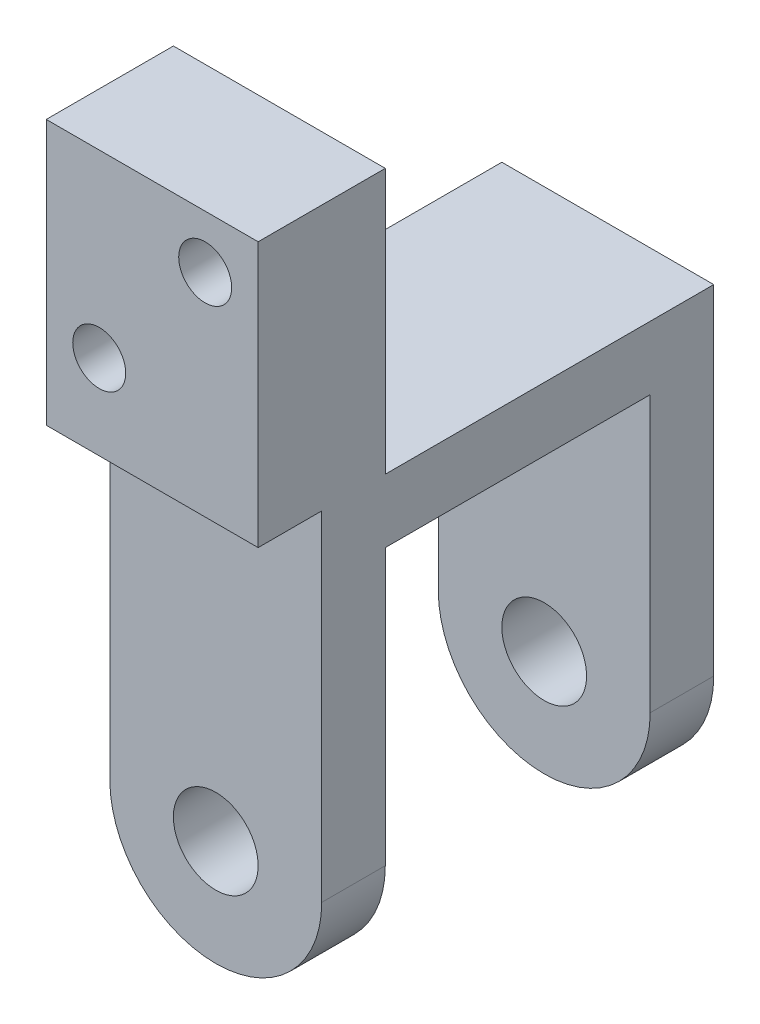
ISO-10303-21;
HEADER;
FILE_DESCRIPTION(('STEP AP214'),'2;1');
FILE_NAME('part.step','',(''),(''),'','','');
FILE_SCHEMA(('AUTOMOTIVE_DESIGN { 1 0 10303 214 1 1 1 1 }'));
ENDSEC;
DATA;
#1=APPLICATION_CONTEXT('core data for automotive mechanical design processes');
#2=APPLICATION_PROTOCOL_DEFINITION('international standard','automotive_design',2000,#1);
#3=PRODUCT_CONTEXT('',#1,'mechanical');
#4=PRODUCT('Part','Part','',(#3));
#5=PRODUCT_RELATED_PRODUCT_CATEGORY('part','',(#4));
#6=PRODUCT_DEFINITION_FORMATION('','',#4);
#7=PRODUCT_DEFINITION_CONTEXT('part definition',#1,'design');
#8=PRODUCT_DEFINITION('design','',#6,#7);
#9=PRODUCT_DEFINITION_SHAPE('','',#8);
#10=(LENGTH_UNIT() NAMED_UNIT(*) SI_UNIT(.MILLI.,.METRE.));
#11=(NAMED_UNIT(*) PLANE_ANGLE_UNIT() SI_UNIT($,.RADIAN.));
#12=(NAMED_UNIT(*) SI_UNIT($,.STERADIAN.) SOLID_ANGLE_UNIT());
#13=UNCERTAINTY_MEASURE_WITH_UNIT(LENGTH_MEASURE(1.E-05),#10,'distance_accuracy_value','');
#14=(GEOMETRIC_REPRESENTATION_CONTEXT(3) GLOBAL_UNCERTAINTY_ASSIGNED_CONTEXT((#13)) GLOBAL_UNIT_ASSIGNED_CONTEXT((#10,
#11,#12)) REPRESENTATION_CONTEXT('',''));
#15=CARTESIAN_POINT('',(0.,0.,0.));
#16=DIRECTION('',(0.,0.,1.));
#17=DIRECTION('',(1.,0.,0.));
#18=AXIS2_PLACEMENT_3D('',#15,#16,#17);
#19=CARTESIAN_POINT('',(-26.3978525851366,12.0014067199145,37.));
#20=DIRECTION('',(0.,-1.,0.));
#21=DIRECTION('',(1.,0.,0.));
#22=AXIS2_PLACEMENT_3D('',#19,#20,#21);
#23=PLANE('',#22);
#24=DIRECTION('',(-1.,0.,0.));
#25=VECTOR('',#24,1.);
#26=CARTESIAN_POINT('',(-26.3978525851366,12.0014067199145,31.));
#27=LINE('',#26,#25);
#28=CARTESIAN_POINT('',(-26.3978525851366,12.0014067199145,31.));
#29=VERTEX_POINT('',#28);
#30=CARTESIAN_POINT('',(-46.3978525851366,12.0014067199145,31.));
#31=VERTEX_POINT('',#30);
#32=EDGE_CURVE('E58',#29,#31,#27,.T.);
#33=ORIENTED_EDGE('',*,*,#32,.F.);
#34=DIRECTION('',(0.,0.,-1.));
#35=VECTOR('',#34,1.);
#36=CARTESIAN_POINT('',(-26.3978525851366,12.0014067199145,37.));
#37=LINE('',#36,#35);
#38=CARTESIAN_POINT('',(-26.3978525851366,12.0014067199145,0.));
#39=VERTEX_POINT('',#38);
#40=EDGE_CURVE('E211',#29,#39,#37,.T.);
#41=ORIENTED_EDGE('',*,*,#40,.T.);
#42=DIRECTION('',(-1.,0.,0.));
#43=VECTOR('',#42,1.);
#44=CARTESIAN_POINT('',(-26.3978525851366,12.0014067199145,0.));
#45=LINE('',#44,#43);
#46=CARTESIAN_POINT('',(-46.3978525851366,12.0014067199145,0.));
#47=VERTEX_POINT('',#46);
#48=EDGE_CURVE('E201',#39,#47,#45,.T.);
#49=ORIENTED_EDGE('',*,*,#48,.T.);
#50=DIRECTION('',(0.,0.,-1.));
#51=VECTOR('',#50,1.);
#52=CARTESIAN_POINT('',(-46.3978525851366,12.0014067199145,37.));
#53=LINE('',#52,#51);
#54=EDGE_CURVE('E11',#31,#47,#53,.T.);
#55=ORIENTED_EDGE('',*,*,#54,.F.);
#56=EDGE_LOOP('',(#33,#41,#49,#55));
#57=FACE_BOUND('',#56,.T.);
#58=ADVANCED_FACE('F34',(#57),#23,.F.);
#59=CARTESIAN_POINT('',(-36.3978525851366,-19.9985932800855,37.));
#60=DIRECTION('',(0.,0.,-1.));
#61=DIRECTION('',(-1.,0.,0.));
#62=AXIS2_PLACEMENT_3D('',#59,#60,#61);
#63=CYLINDRICAL_SURFACE('',#62,10.);
#64=DIRECTION('',(0.,0.,-1.));
#65=VECTOR('',#64,1.);
#66=CARTESIAN_POINT('',(-46.3978525851366,-19.9985932800855,37.));
#67=LINE('',#66,#65);
#68=CARTESIAN_POINT('',(-46.3978525851366,-19.9985932800855,37.));
#69=VERTEX_POINT('',#68);
#70=CARTESIAN_POINT('',(-46.3978525851366,-19.9985932800855,31.));
#71=VERTEX_POINT('',#70);
#72=EDGE_CURVE('E42',#69,#71,#67,.T.);
#73=ORIENTED_EDGE('',*,*,#72,.T.);
#74=CARTESIAN_POINT('',(-36.3978525851366,-19.9985932800855,31.));
#75=DIRECTION('',(0.,0.,1.));
#76=DIRECTION('',(0.,-1.,0.));
#77=AXIS2_PLACEMENT_3D('',#74,#75,#76);
#78=CIRCLE('',#77,10.);
#79=CARTESIAN_POINT('',(-26.3978525851366,-19.9985932800855,31.));
#80=VERTEX_POINT('',#79);
#81=EDGE_CURVE('E194',#71,#80,#78,.T.);
#82=ORIENTED_EDGE('',*,*,#81,.T.);
#83=DIRECTION('',(0.,0.,-1.));
#84=VECTOR('',#83,1.);
#85=CARTESIAN_POINT('',(-26.3978525851366,-19.9985932800855,37.));
#86=LINE('',#85,#84);
#87=CARTESIAN_POINT('',(-26.3978525851366,-19.9985932800855,37.));
#88=VERTEX_POINT('',#87);
#89=EDGE_CURVE('E224',#88,#80,#86,.T.);
#90=ORIENTED_EDGE('',*,*,#89,.F.);
#91=CARTESIAN_POINT('',(-36.3978525851366,-19.9985932800855,37.));
#92=DIRECTION('',(0.,0.,1.));
#93=DIRECTION('',(1.,0.,0.));
#94=AXIS2_PLACEMENT_3D('',#91,#92,#93);
#95=CIRCLE('',#94,10.);
#96=EDGE_CURVE('E206',#69,#88,#95,.T.);
#97=ORIENTED_EDGE('',*,*,#96,.F.);
#98=EDGE_LOOP('',(#73,#82,#90,#97));
#99=FACE_BOUND('',#98,.T.);
#100=ADVANCED_FACE('F254',(#99),#63,.T.);
#101=CARTESIAN_POINT('',(-36.3978525851366,-19.9985932800855,37.));
#102=DIRECTION('',(0.,0.,-1.));
#103=DIRECTION('',(-1.,0.,0.));
#104=AXIS2_PLACEMENT_3D('',#101,#102,#103);
#105=CYLINDRICAL_SURFACE('',#104,4.00000000000001);
#106=CARTESIAN_POINT('',(-36.3978525851366,-19.9985932800855,31.));
#107=DIRECTION('',(0.,0.,1.));
#108=DIRECTION('',(0.,-1.,0.));
#109=AXIS2_PLACEMENT_3D('',#106,#107,#108);
#110=CIRCLE('',#109,4.00000000000001);
#111=CARTESIAN_POINT('',(-36.3978525851366,-23.9985932800856,31.));
#112=VERTEX_POINT('',#111);
#113=EDGE_CURVE('E37',#112,#112,#110,.F.);
#114=ORIENTED_EDGE('',*,*,#113,.T.);
#115=EDGE_LOOP('',(#114));
#116=FACE_BOUND('',#115,.T.);
#117=CARTESIAN_POINT('',(-36.3978525851366,-19.9985932800855,37.));
#118=DIRECTION('',(0.,0.,-1.));
#119=DIRECTION('',(-1.,0.,0.));
#120=AXIS2_PLACEMENT_3D('',#117,#118,#119);
#121=CIRCLE('',#120,4.00000000000001);
#122=CARTESIAN_POINT('',(-40.3978525851366,-19.9985932800855,37.));
#123=VERTEX_POINT('',#122);
#124=EDGE_CURVE('E198',#123,#123,#121,.T.);
#125=ORIENTED_EDGE('',*,*,#124,.F.);
#126=EDGE_LOOP('',(#125));
#127=FACE_BOUND('',#126,.T.);
#128=ADVANCED_FACE('F287',(#116,#127),#105,.F.);
#129=CARTESIAN_POINT('',(-46.3978525851366,12.0014067199145,37.));
#130=DIRECTION('',(1.,0.,0.));
#131=DIRECTION('',(0.,0.,-1.));
#132=AXIS2_PLACEMENT_3D('',#129,#130,#131);
#133=PLANE('',#132);
#134=DIRECTION('',(0.,0.,1.));
#135=VECTOR('',#134,1.);
#136=CARTESIAN_POINT('',(-46.3978525851366,6.00140671991445,31.));
#137=LINE('',#136,#135);
#138=CARTESIAN_POINT('',(-46.3978525851366,6.00140671991445,6.));
#139=VERTEX_POINT('',#138);
#140=CARTESIAN_POINT('',(-46.3978525851366,6.00140671991445,31.));
#141=VERTEX_POINT('',#140);
#142=EDGE_CURVE('E178',#139,#141,#137,.T.);
#143=ORIENTED_EDGE('',*,*,#142,.T.);
#144=DIRECTION('',(0.,-1.,0.));
#145=VECTOR('',#144,1.);
#146=CARTESIAN_POINT('',(-46.3978525851366,6.00140671991445,31.));
#147=LINE('',#146,#145);
#148=EDGE_CURVE('E171',#141,#71,#147,.T.);
#149=ORIENTED_EDGE('',*,*,#148,.T.);
#150=ORIENTED_EDGE('',*,*,#72,.F.);
#151=DIRECTION('',(0.,-1.,0.));
#152=VECTOR('',#151,1.);
#153=CARTESIAN_POINT('',(-46.3978525851366,12.0014067199145,37.));
#154=LINE('',#153,#152);
#155=CARTESIAN_POINT('',(-46.3978525851366,12.0014067199145,37.));
#156=VERTEX_POINT('',#155);
#157=EDGE_CURVE('E204',#156,#69,#154,.T.);
#158=ORIENTED_EDGE('',*,*,#157,.F.);
#159=DIRECTION('',(0.,0.,-1.));
#160=VECTOR('',#159,1.);
#161=CARTESIAN_POINT('',(-46.3978525851366,12.0014067199145,43.));
#162=LINE('',#161,#160);
#163=CARTESIAN_POINT('',(-46.3978525851366,12.0014067199145,43.));
#164=VERTEX_POINT('',#163);
#165=EDGE_CURVE('E141',#164,#156,#162,.T.);
#166=ORIENTED_EDGE('',*,*,#165,.F.);
#167=DIRECTION('',(0.,-1.,0.));
#168=VECTOR('',#167,1.);
#169=CARTESIAN_POINT('',(-46.3978525851366,37.0014067199145,43.));
#170=LINE('',#169,#168);
#171=CARTESIAN_POINT('',(-46.3978525851366,37.0014067199145,43.));
#172=VERTEX_POINT('',#171);
#173=EDGE_CURVE('E137',#172,#164,#170,.T.);
#174=ORIENTED_EDGE('',*,*,#173,.F.);
#175=DIRECTION('',(0.,0.,1.));
#176=VECTOR('',#175,1.);
#177=CARTESIAN_POINT('',(-46.3978525851366,37.0014067199145,31.));
#178=LINE('',#177,#176);
#179=CARTESIAN_POINT('',(-46.3978525851366,37.0014067199145,31.));
#180=VERTEX_POINT('',#179);
#181=EDGE_CURVE('E124',#180,#172,#178,.T.);
#182=ORIENTED_EDGE('',*,*,#181,.F.);
#183=DIRECTION('',(0.,1.,0.));
#184=VECTOR('',#183,1.);
#185=CARTESIAN_POINT('',(-46.3978525851366,12.0014067199145,31.));
#186=LINE('',#185,#184);
#187=EDGE_CURVE('E167',#31,#180,#186,.T.);
#188=ORIENTED_EDGE('',*,*,#187,.F.);
#189=ORIENTED_EDGE('',*,*,#54,.T.);
#190=DIRECTION('',(0.,-1.,0.));
#191=VECTOR('',#190,1.);
#192=CARTESIAN_POINT('',(-46.3978525851366,12.0014067199145,0.));
#193=LINE('',#192,#191);
#194=CARTESIAN_POINT('',(-46.3978525851366,-19.9985932800855,0.));
#195=VERTEX_POINT('',#194);
#196=EDGE_CURVE('E214',#47,#195,#193,.T.);
#197=ORIENTED_EDGE('',*,*,#196,.T.);
#198=CARTESIAN_POINT('',(-46.3978525851366,-19.9985932800855,6.));
#199=VERTEX_POINT('',#198);
#200=EDGE_CURVE('E227',#199,#195,#67,.T.);
#201=ORIENTED_EDGE('',*,*,#200,.F.);
#202=DIRECTION('',(0.,1.,0.));
#203=VECTOR('',#202,1.);
#204=CARTESIAN_POINT('',(-46.3978525851366,6.00140671991445,6.));
#205=LINE('',#204,#203);
#206=EDGE_CURVE('E174',#199,#139,#205,.T.);
#207=ORIENTED_EDGE('',*,*,#206,.T.);
#208=EDGE_LOOP('',(#143,#149,#150,#158,#166,#174,#182,#188,#189,#197,#201,#207));
#209=FACE_BOUND('',#208,.T.);
#210=ADVANCED_FACE('F139',(#209),#133,.F.);
#211=CARTESIAN_POINT('',(-26.3978525851366,-19.9985932800855,6.));
#212=VERTEX_POINT('',#211);
#213=CARTESIAN_POINT('',(-26.3978525851366,-19.9985932800855,0.));
#214=VERTEX_POINT('',#213);
#215=EDGE_CURVE('E223',#212,#214,#86,.T.);
#216=ORIENTED_EDGE('',*,*,#215,.F.);
#217=CARTESIAN_POINT('',(-36.3978525851366,-19.9985932800855,6.));
#218=DIRECTION('',(0.,0.,-1.));
#219=DIRECTION('',(-1.,0.,0.));
#220=AXIS2_PLACEMENT_3D('',#217,#218,#219);
#221=CIRCLE('',#220,10.);
#222=EDGE_CURVE('E191',#212,#199,#221,.T.);
#223=ORIENTED_EDGE('',*,*,#222,.T.);
#224=ORIENTED_EDGE('',*,*,#200,.T.);
#225=CARTESIAN_POINT('',(-36.3978525851366,-19.9985932800855,0.));
#226=DIRECTION('',(0.,0.,1.));
#227=DIRECTION('',(1.,0.,0.));
#228=AXIS2_PLACEMENT_3D('',#225,#226,#227);
#229=CIRCLE('',#228,10.);
#230=EDGE_CURVE('E217',#195,#214,#229,.T.);
#231=ORIENTED_EDGE('',*,*,#230,.T.);
#232=EDGE_LOOP('',(#216,#223,#224,#231));
#233=FACE_BOUND('',#232,.T.);
#234=ADVANCED_FACE('F259',(#233),#63,.T.);
#235=CARTESIAN_POINT('',(-26.3978525851366,-19.9985932800855,37.));
#236=DIRECTION('',(-1.,0.,0.));
#237=DIRECTION('',(0.,0.,1.));
#238=AXIS2_PLACEMENT_3D('',#235,#236,#237);
#239=PLANE('',#238);
#240=ORIENTED_EDGE('',*,*,#89,.T.);
#241=DIRECTION('',(0.,-1.,0.));
#242=VECTOR('',#241,1.);
#243=CARTESIAN_POINT('',(-26.3978525851366,6.00140671991445,31.));
#244=LINE('',#243,#242);
#245=CARTESIAN_POINT('',(-26.3978525851366,6.00140671991445,31.));
#246=VERTEX_POINT('',#245);
#247=EDGE_CURVE('E133',#246,#80,#244,.T.);
#248=ORIENTED_EDGE('',*,*,#247,.F.);
#249=DIRECTION('',(0.,0.,1.));
#250=VECTOR('',#249,1.);
#251=CARTESIAN_POINT('',(-26.3978525851366,6.00140671991445,31.));
#252=LINE('',#251,#250);
#253=CARTESIAN_POINT('',(-26.3978525851366,6.00140671991445,6.));
#254=VERTEX_POINT('',#253);
#255=EDGE_CURVE('E175',#254,#246,#252,.T.);
#256=ORIENTED_EDGE('',*,*,#255,.F.);
#257=DIRECTION('',(0.,1.,0.));
#258=VECTOR('',#257,1.);
#259=CARTESIAN_POINT('',(-26.3978525851366,6.00140671991445,6.));
#260=LINE('',#259,#258);
#261=EDGE_CURVE('E182',#212,#254,#260,.T.);
#262=ORIENTED_EDGE('',*,*,#261,.F.);
#263=ORIENTED_EDGE('',*,*,#215,.T.);
#264=DIRECTION('',(0.,1.,0.));
#265=VECTOR('',#264,1.);
#266=CARTESIAN_POINT('',(-26.3978525851366,-19.9985932800855,0.));
#267=LINE('',#266,#265);
#268=EDGE_CURVE('E207',#214,#39,#267,.T.);
#269=ORIENTED_EDGE('',*,*,#268,.T.);
#270=ORIENTED_EDGE('',*,*,#40,.F.);
#271=DIRECTION('',(0.,-1.,0.));
#272=VECTOR('',#271,1.);
#273=CARTESIAN_POINT('',(-26.3978525851366,37.0014067199145,31.));
#274=LINE('',#273,#272);
#275=CARTESIAN_POINT('',(-26.3978525851366,37.0014067199145,31.));
#276=VERTEX_POINT('',#275);
#277=EDGE_CURVE('E163',#276,#29,#274,.T.);
#278=ORIENTED_EDGE('',*,*,#277,.F.);
#279=DIRECTION('',(0.,0.,1.));
#280=VECTOR('',#279,1.);
#281=CARTESIAN_POINT('',(-26.3978525851366,37.0014067199145,31.));
#282=LINE('',#281,#280);
#283=CARTESIAN_POINT('',(-26.3978525851366,37.0014067199145,43.));
#284=VERTEX_POINT('',#283);
#285=EDGE_CURVE('E134',#276,#284,#282,.T.);
#286=ORIENTED_EDGE('',*,*,#285,.T.);
#287=DIRECTION('',(0.,1.,0.));
#288=VECTOR('',#287,1.);
#289=CARTESIAN_POINT('',(-26.3978525851366,12.0014067199145,43.));
#290=LINE('',#289,#288);
#291=CARTESIAN_POINT('',(-26.3978525851366,12.0014067199145,43.));
#292=VERTEX_POINT('',#291);
#293=EDGE_CURVE('E149',#292,#284,#290,.T.);
#294=ORIENTED_EDGE('',*,*,#293,.F.);
#295=DIRECTION('',(0.,0.,-1.));
#296=VECTOR('',#295,1.);
#297=CARTESIAN_POINT('',(-26.3978525851366,12.0014067199145,43.));
#298=LINE('',#297,#296);
#299=CARTESIAN_POINT('',(-26.3978525851366,12.0014067199145,37.));
#300=VERTEX_POINT('',#299);
#301=EDGE_CURVE('E158',#292,#300,#298,.T.);
#302=ORIENTED_EDGE('',*,*,#301,.T.);
#303=DIRECTION('',(0.,1.,0.));
#304=VECTOR('',#303,1.);
#305=CARTESIAN_POINT('',(-26.3978525851366,-19.9985932800855,37.));
#306=LINE('',#305,#304);
#307=EDGE_CURVE('E209',#88,#300,#306,.T.);
#308=ORIENTED_EDGE('',*,*,#307,.F.);
#309=EDGE_LOOP('',(#240,#248,#256,#262,#263,#269,#270,#278,#286,#294,#302,#308));
#310=FACE_BOUND('',#309,.T.);
#311=ADVANCED_FACE('F248',(#310),#239,.F.);
#312=CARTESIAN_POINT('',(-36.3978525851366,-19.9985932800855,37.));
#313=DIRECTION('',(0.,0.,1.));
#314=DIRECTION('',(1.,0.,0.));
#315=AXIS2_PLACEMENT_3D('',#312,#313,#314);
#316=PLANE('',#315);
#317=DIRECTION('',(1.,0.,0.));
#318=VECTOR('',#317,1.);
#319=CARTESIAN_POINT('',(-46.3978525851366,12.0014067199145,37.));
#320=LINE('',#319,#318);
#321=EDGE_CURVE('E50',#156,#300,#320,.T.);
#322=ORIENTED_EDGE('',*,*,#321,.F.);
#323=ORIENTED_EDGE('',*,*,#157,.T.);
#324=ORIENTED_EDGE('',*,*,#96,.T.);
#325=ORIENTED_EDGE('',*,*,#307,.T.);
#326=EDGE_LOOP('',(#322,#323,#324,#325));
#327=FACE_BOUND('',#326,.T.);
#328=ORIENTED_EDGE('',*,*,#124,.T.);
#329=EDGE_LOOP('',(#328));
#330=FACE_BOUND('',#329,.T.);
#331=ADVANCED_FACE('F300',(#327,#330),#316,.T.);
#332=CARTESIAN_POINT('',(-36.3978525851366,-19.9985932800855,0.));
#333=DIRECTION('',(0.,0.,1.));
#334=DIRECTION('',(1.,0.,0.));
#335=AXIS2_PLACEMENT_3D('',#332,#333,#334);
#336=PLANE('',#335);
#337=CARTESIAN_POINT('',(-36.3978525851366,-19.9985932800855,0.));
#338=DIRECTION('',(0.,0.,-1.));
#339=DIRECTION('',(-1.,0.,0.));
#340=AXIS2_PLACEMENT_3D('',#337,#338,#339);
#341=CIRCLE('',#340,4.00000000000001);
#342=CARTESIAN_POINT('',(-40.3978525851366,-19.9985932800855,0.));
#343=VERTEX_POINT('',#342);
#344=EDGE_CURVE('E197',#343,#343,#341,.T.);
#345=ORIENTED_EDGE('',*,*,#344,.F.);
#346=EDGE_LOOP('',(#345));
#347=FACE_BOUND('',#346,.T.);
#348=ORIENTED_EDGE('',*,*,#48,.F.);
#349=ORIENTED_EDGE('',*,*,#268,.F.);
#350=ORIENTED_EDGE('',*,*,#230,.F.);
#351=ORIENTED_EDGE('',*,*,#196,.F.);
#352=EDGE_LOOP('',(#348,#349,#350,#351));
#353=FACE_BOUND('',#352,.T.);
#354=ADVANCED_FACE('F266',(#347,#353),#336,.F.);
#355=CARTESIAN_POINT('',(-36.3978525851366,-19.9985932800855,6.));
#356=DIRECTION('',(0.,0.,-1.));
#357=DIRECTION('',(-1.,0.,0.));
#358=AXIS2_PLACEMENT_3D('',#355,#356,#357);
#359=CIRCLE('',#358,4.00000000000001);
#360=CARTESIAN_POINT('',(-40.3978525851366,-19.9985932800855,6.));
#361=VERTEX_POINT('',#360);
#362=EDGE_CURVE('E188',#361,#361,#359,.F.);
#363=ORIENTED_EDGE('',*,*,#362,.T.);
#364=EDGE_LOOP('',(#363));
#365=FACE_BOUND('',#364,.T.);
#366=ORIENTED_EDGE('',*,*,#344,.T.);
#367=EDGE_LOOP('',(#366));
#368=FACE_BOUND('',#367,.T.);
#369=ADVANCED_FACE('F232',(#365,#368),#105,.F.);
#370=CARTESIAN_POINT('',(-46.3978525851366,6.00140671991445,31.));
#371=DIRECTION('',(0.,0.,1.));
#372=DIRECTION('',(0.,-1.,0.));
#373=AXIS2_PLACEMENT_3D('',#370,#371,#372);
#374=PLANE('',#373);
#375=ORIENTED_EDGE('',*,*,#113,.F.);
#376=EDGE_LOOP('',(#375));
#377=FACE_BOUND('',#376,.T.);
#378=ORIENTED_EDGE('',*,*,#148,.F.);
#379=DIRECTION('',(1.,0.,0.));
#380=VECTOR('',#379,1.);
#381=CARTESIAN_POINT('',(-46.3978525851366,6.00140671991445,31.));
#382=LINE('',#381,#380);
#383=EDGE_CURVE('E186',#141,#246,#382,.T.);
#384=ORIENTED_EDGE('',*,*,#383,.T.);
#385=ORIENTED_EDGE('',*,*,#247,.T.);
#386=ORIENTED_EDGE('',*,*,#81,.F.);
#387=EDGE_LOOP('',(#378,#384,#385,#386));
#388=FACE_BOUND('',#387,.T.);
#389=ADVANCED_FACE('F239',(#377,#388),#374,.F.);
#390=CARTESIAN_POINT('',(-46.3978525851366,6.00140671991445,6.));
#391=DIRECTION('',(0.,0.,-1.));
#392=DIRECTION('',(-1.,0.,0.));
#393=AXIS2_PLACEMENT_3D('',#390,#391,#392);
#394=PLANE('',#393);
#395=ORIENTED_EDGE('',*,*,#362,.F.);
#396=EDGE_LOOP('',(#395));
#397=FACE_BOUND('',#396,.T.);
#398=ORIENTED_EDGE('',*,*,#261,.T.);
#399=DIRECTION('',(1.,0.,0.));
#400=VECTOR('',#399,1.);
#401=CARTESIAN_POINT('',(-46.3978525851366,6.00140671991445,6.));
#402=LINE('',#401,#400);
#403=EDGE_CURVE('E180',#139,#254,#402,.T.);
#404=ORIENTED_EDGE('',*,*,#403,.F.);
#405=ORIENTED_EDGE('',*,*,#206,.F.);
#406=ORIENTED_EDGE('',*,*,#222,.F.);
#407=EDGE_LOOP('',(#398,#404,#405,#406));
#408=FACE_BOUND('',#407,.T.);
#409=ADVANCED_FACE('F235',(#397,#408),#394,.F.);
#410=CARTESIAN_POINT('',(-46.3978525851366,6.00140671991445,31.));
#411=DIRECTION('',(0.,1.,0.));
#412=DIRECTION('',(0.,0.,1.));
#413=AXIS2_PLACEMENT_3D('',#410,#411,#412);
#414=PLANE('',#413);
#415=ORIENTED_EDGE('',*,*,#255,.T.);
#416=ORIENTED_EDGE('',*,*,#383,.F.);
#417=ORIENTED_EDGE('',*,*,#142,.F.);
#418=ORIENTED_EDGE('',*,*,#403,.T.);
#419=EDGE_LOOP('',(#415,#416,#417,#418));
#420=FACE_BOUND('',#419,.T.);
#421=ADVANCED_FACE('F238',(#420),#414,.F.);
#422=CARTESIAN_POINT('',(-46.3978525851366,37.0014067199145,31.));
#423=DIRECTION('',(0.,-1.,0.));
#424=DIRECTION('',(0.,0.,-1.));
#425=AXIS2_PLACEMENT_3D('',#422,#423,#424);
#426=PLANE('',#425);
#427=ORIENTED_EDGE('',*,*,#181,.T.);
#428=DIRECTION('',(-1.,0.,0.));
#429=VECTOR('',#428,1.);
#430=CARTESIAN_POINT('',(-26.3978525851366,37.0014067199145,43.));
#431=LINE('',#430,#429);
#432=EDGE_CURVE('E129',#284,#172,#431,.T.);
#433=ORIENTED_EDGE('',*,*,#432,.F.);
#434=ORIENTED_EDGE('',*,*,#285,.F.);
#435=DIRECTION('',(1.,0.,0.));
#436=VECTOR('',#435,1.);
#437=CARTESIAN_POINT('',(-46.3978525851366,37.0014067199145,31.));
#438=LINE('',#437,#436);
#439=EDGE_CURVE('E130',#180,#276,#438,.T.);
#440=ORIENTED_EDGE('',*,*,#439,.F.);
#441=EDGE_LOOP('',(#427,#433,#434,#440));
#442=FACE_BOUND('',#441,.T.);
#443=ADVANCED_FACE('F126',(#442),#426,.F.);
#444=CARTESIAN_POINT('',(0.,0.,31.));
#445=DIRECTION('',(0.,0.,-1.));
#446=DIRECTION('',(-1.,0.,0.));
#447=AXIS2_PLACEMENT_3D('',#444,#445,#446);
#448=PLANE('',#447);
#449=CARTESIAN_POINT('',(-31.3978525851366,32.0014067199145,31.));
#450=DIRECTION('',(0.,0.,-1.));
#451=DIRECTION('',(-1.,0.,0.));
#452=AXIS2_PLACEMENT_3D('',#449,#450,#451);
#453=CIRCLE('',#452,2.5);
#454=CARTESIAN_POINT('',(-33.8978525851366,32.0014067199145,31.));
#455=VERTEX_POINT('',#454);
#456=EDGE_CURVE('E435',#455,#455,#453,.T.);
#457=ORIENTED_EDGE('',*,*,#456,.F.);
#458=EDGE_LOOP('',(#457));
#459=FACE_BOUND('',#458,.T.);
#460=CARTESIAN_POINT('',(-41.3978525851366,20.0014067199145,31.));
#461=DIRECTION('',(0.,0.,-1.));
#462=DIRECTION('',(-1.,0.,0.));
#463=AXIS2_PLACEMENT_3D('',#460,#461,#462);
#464=CIRCLE('',#463,2.5);
#465=CARTESIAN_POINT('',(-43.8978525851366,20.0014067199145,31.));
#466=VERTEX_POINT('',#465);
#467=EDGE_CURVE('E154',#466,#466,#464,.T.);
#468=ORIENTED_EDGE('',*,*,#467,.F.);
#469=EDGE_LOOP('',(#468));
#470=FACE_BOUND('',#469,.T.);
#471=ORIENTED_EDGE('',*,*,#277,.T.);
#472=ORIENTED_EDGE('',*,*,#32,.T.);
#473=ORIENTED_EDGE('',*,*,#187,.T.);
#474=ORIENTED_EDGE('',*,*,#439,.T.);
#475=EDGE_LOOP('',(#471,#472,#473,#474));
#476=FACE_BOUND('',#475,.T.);
#477=ADVANCED_FACE('F268',(#459,#470,#476),#448,.T.);
#478=CARTESIAN_POINT('',(-46.3978525851366,12.0014067199145,43.));
#479=DIRECTION('',(0.,1.,0.));
#480=DIRECTION('',(-1.,0.,0.));
#481=AXIS2_PLACEMENT_3D('',#478,#479,#480);
#482=PLANE('',#481);
#483=ORIENTED_EDGE('',*,*,#321,.T.);
#484=ORIENTED_EDGE('',*,*,#301,.F.);
#485=DIRECTION('',(1.,0.,0.));
#486=VECTOR('',#485,1.);
#487=CARTESIAN_POINT('',(-46.3978525851366,12.0014067199145,43.));
#488=LINE('',#487,#486);
#489=EDGE_CURVE('E144',#164,#292,#488,.T.);
#490=ORIENTED_EDGE('',*,*,#489,.F.);
#491=ORIENTED_EDGE('',*,*,#165,.T.);
#492=EDGE_LOOP('',(#483,#484,#490,#491));
#493=FACE_BOUND('',#492,.T.);
#494=ADVANCED_FACE('F271',(#493),#482,.F.);
#495=CARTESIAN_POINT('',(0.,0.,43.));
#496=DIRECTION('',(0.,0.,1.));
#497=DIRECTION('',(1.,0.,0.));
#498=AXIS2_PLACEMENT_3D('',#495,#496,#497);
#499=PLANE('',#498);
#500=CARTESIAN_POINT('',(-31.3978525851366,32.0014067199145,43.));
#501=DIRECTION('',(0.,0.,-1.));
#502=DIRECTION('',(-1.,0.,0.));
#503=AXIS2_PLACEMENT_3D('',#500,#501,#502);
#504=CIRCLE('',#503,2.5);
#505=CARTESIAN_POINT('',(-33.8978525851366,32.0014067199145,43.));
#506=VERTEX_POINT('',#505);
#507=EDGE_CURVE('E151',#506,#506,#504,.T.);
#508=ORIENTED_EDGE('',*,*,#507,.T.);
#509=EDGE_LOOP('',(#508));
#510=FACE_BOUND('',#509,.T.);
#511=CARTESIAN_POINT('',(-41.3978525851366,20.0014067199145,43.));
#512=DIRECTION('',(0.,0.,-1.));
#513=DIRECTION('',(-1.,0.,0.));
#514=AXIS2_PLACEMENT_3D('',#511,#512,#513);
#515=CIRCLE('',#514,2.5);
#516=CARTESIAN_POINT('',(-43.8978525851366,20.0014067199145,43.));
#517=VERTEX_POINT('',#516);
#518=EDGE_CURVE('E436',#517,#517,#515,.T.);
#519=ORIENTED_EDGE('',*,*,#518,.T.);
#520=EDGE_LOOP('',(#519));
#521=FACE_BOUND('',#520,.T.);
#522=ORIENTED_EDGE('',*,*,#432,.T.);
#523=ORIENTED_EDGE('',*,*,#173,.T.);
#524=ORIENTED_EDGE('',*,*,#489,.T.);
#525=ORIENTED_EDGE('',*,*,#293,.T.);
#526=EDGE_LOOP('',(#522,#523,#524,#525));
#527=FACE_BOUND('',#526,.T.);
#528=ADVANCED_FACE('F147',(#510,#521,#527),#499,.T.);
#529=CARTESIAN_POINT('',(-41.3978525851366,20.0014067199145,43.));
#530=DIRECTION('',(0.,0.,-1.));
#531=DIRECTION('',(-1.,0.,0.));
#532=AXIS2_PLACEMENT_3D('',#529,#530,#531);
#533=CYLINDRICAL_SURFACE('',#532,2.5);
#534=ORIENTED_EDGE('',*,*,#518,.F.);
#535=EDGE_LOOP('',(#534));
#536=FACE_BOUND('',#535,.T.);
#537=ORIENTED_EDGE('',*,*,#467,.T.);
#538=EDGE_LOOP('',(#537));
#539=FACE_BOUND('',#538,.T.);
#540=ADVANCED_FACE('F278',(#536,#539),#533,.F.);
#541=CARTESIAN_POINT('',(-31.3978525851366,32.0014067199145,43.));
#542=DIRECTION('',(0.,0.,-1.));
#543=DIRECTION('',(-1.,0.,0.));
#544=AXIS2_PLACEMENT_3D('',#541,#542,#543);
#545=CYLINDRICAL_SURFACE('',#544,2.5);
#546=ORIENTED_EDGE('',*,*,#507,.F.);
#547=EDGE_LOOP('',(#546));
#548=FACE_BOUND('',#547,.T.);
#549=ORIENTED_EDGE('',*,*,#456,.T.);
#550=EDGE_LOOP('',(#549));
#551=FACE_BOUND('',#550,.T.);
#552=ADVANCED_FACE('F416',(#548,#551),#545,.F.);
#553=CLOSED_SHELL('',(#58,#100,#128,#210,#234,#311,#331,#354,#369,#389,#409,#421,#443,#477,#494,
#528,#540,#552));
#554=MANIFOLD_SOLID_BREP('B2',#553);
#555=ADVANCED_BREP_SHAPE_REPRESENTATION('',(#18,#554),#14);
#556=SHAPE_DEFINITION_REPRESENTATION(#9,#555);
ENDSEC;
END-ISO-10303-21;
